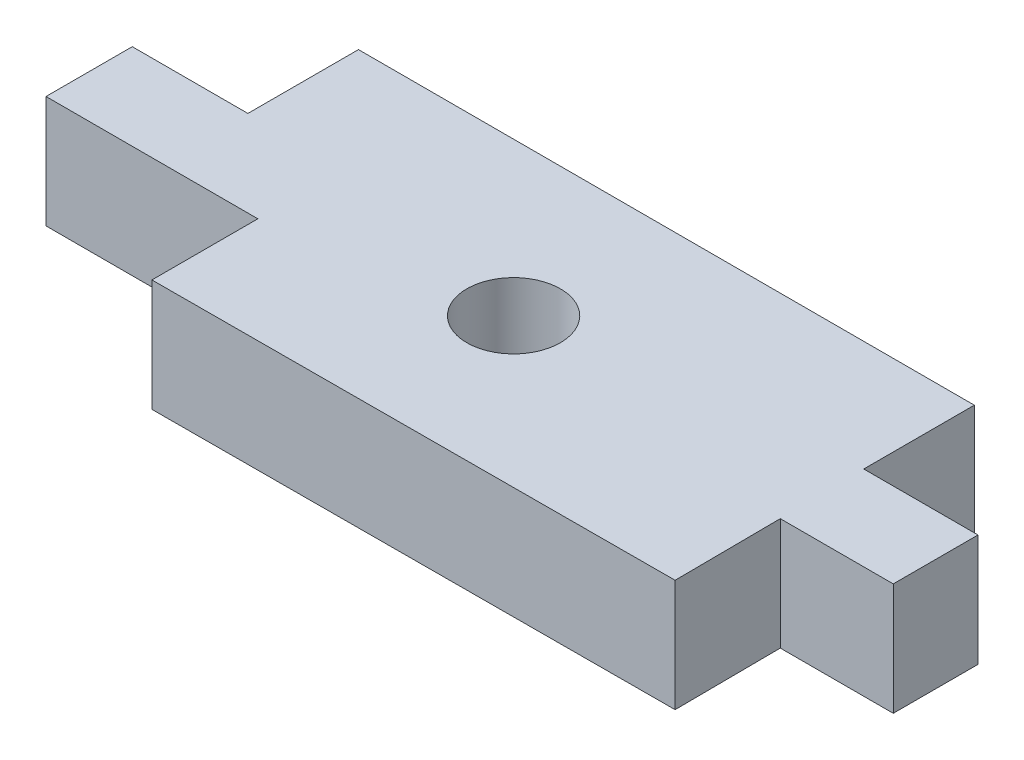
ISO-10303-21;
HEADER;
FILE_DESCRIPTION(('STEP AP214'),'2;1');
FILE_NAME('part.step','',(''),(''),'','','');
FILE_SCHEMA(('AUTOMOTIVE_DESIGN { 1 0 10303 214 1 1 1 1 }'));
ENDSEC;
DATA;
#1=APPLICATION_CONTEXT('core data for automotive mechanical design processes');
#2=APPLICATION_PROTOCOL_DEFINITION('international standard','automotive_design',2000,#1);
#3=PRODUCT_CONTEXT('',#1,'mechanical');
#4=PRODUCT('Part','Part','',(#3));
#5=PRODUCT_RELATED_PRODUCT_CATEGORY('part','',(#4));
#6=PRODUCT_DEFINITION_FORMATION('','',#4);
#7=PRODUCT_DEFINITION_CONTEXT('part definition',#1,'design');
#8=PRODUCT_DEFINITION('design','',#6,#7);
#9=PRODUCT_DEFINITION_SHAPE('','',#8);
#10=(LENGTH_UNIT() NAMED_UNIT(*) SI_UNIT(.MILLI.,.METRE.));
#11=(NAMED_UNIT(*) PLANE_ANGLE_UNIT() SI_UNIT($,.RADIAN.));
#12=(NAMED_UNIT(*) SI_UNIT($,.STERADIAN.) SOLID_ANGLE_UNIT());
#13=UNCERTAINTY_MEASURE_WITH_UNIT(LENGTH_MEASURE(1.E-05),#10,'distance_accuracy_value','');
#14=(GEOMETRIC_REPRESENTATION_CONTEXT(3) GLOBAL_UNCERTAINTY_ASSIGNED_CONTEXT((#13)) GLOBAL_UNIT_ASSIGNED_CONTEXT((#10,
#11,#12)) REPRESENTATION_CONTEXT('',''));
#15=CARTESIAN_POINT('',(0.,0.,0.));
#16=DIRECTION('',(0.,0.,1.));
#17=DIRECTION('',(1.,0.,0.));
#18=AXIS2_PLACEMENT_3D('',#15,#16,#17);
#19=CARTESIAN_POINT('',(0.,3.175,0.));
#20=DIRECTION('',(0.,-1.,0.));
#21=DIRECTION('',(0.,0.,-1.));
#22=AXIS2_PLACEMENT_3D('',#19,#20,#21);
#23=PLANE('',#22);
#24=DIRECTION('',(0.,0.,1.));
#25=VECTOR('',#24,1.);
#26=CARTESIAN_POINT('',(109.997615957605,3.175,-129.036436459114));
#27=LINE('',#26,#25);
#28=CARTESIAN_POINT('',(109.997615957605,3.175,-132.168236459114));
#29=VERTEX_POINT('',#28);
#30=CARTESIAN_POINT('',(109.997615957605,3.175,-129.036436459114));
#31=VERTEX_POINT('',#30);
#32=EDGE_CURVE('E179',#29,#31,#27,.T.);
#33=ORIENTED_EDGE('',*,*,#32,.T.);
#34=DIRECTION('',(-1.,0.,0.));
#35=VECTOR('',#34,1.);
#36=CARTESIAN_POINT('',(106.722915957605,3.175,-129.036436459114));
#37=LINE('',#36,#35);
#38=CARTESIAN_POINT('',(106.722915957605,3.175,-129.036436459114));
#39=VERTEX_POINT('',#38);
#40=EDGE_CURVE('E107',#31,#39,#37,.T.);
#41=ORIENTED_EDGE('',*,*,#40,.T.);
#42=DIRECTION('',(0.,0.,1.));
#43=VECTOR('',#42,1.);
#44=CARTESIAN_POINT('',(106.722915957605,3.175,-129.036436459114));
#45=LINE('',#44,#43);
#46=CARTESIAN_POINT('',(106.722915957605,3.175,-126.593302227627));
#47=VERTEX_POINT('',#46);
#48=EDGE_CURVE('E206',#39,#47,#45,.T.);
#49=ORIENTED_EDGE('',*,*,#48,.T.);
#50=DIRECTION('',(1.,0.,0.));
#51=VECTOR('',#50,1.);
#52=CARTESIAN_POINT('',(112.722877294147,3.175,-126.593302227627));
#53=LINE('',#52,#51);
#54=CARTESIAN_POINT('',(112.722877294147,3.175,-126.593302227627));
#55=VERTEX_POINT('',#54);
#56=EDGE_CURVE('E225',#47,#55,#53,.T.);
#57=ORIENTED_EDGE('',*,*,#56,.T.);
#58=DIRECTION('',(-3.36371008937517E-05,0.,0.999999999434273));
#59=VECTOR('',#58,1.);
#60=CARTESIAN_POINT('',(112.722877294147,3.175,-126.593302227627));
#61=LINE('',#60,#59);
#62=CARTESIAN_POINT('',(112.722776380156,3.175,-123.593222295389));
#63=VERTEX_POINT('',#62);
#64=EDGE_CURVE('E222',#55,#63,#61,.T.);
#65=ORIENTED_EDGE('',*,*,#64,.T.);
#66=DIRECTION('',(0.999995722637218,0.,-0.00292484311857202));
#67=VECTOR('',#66,1.);
#68=CARTESIAN_POINT('',(112.722776380156,3.175,-123.593222295389));
#69=LINE('',#68,#67);
#70=CARTESIAN_POINT('',(127.497578696098,3.175,-123.636436459114));
#71=VERTEX_POINT('',#70);
#72=EDGE_CURVE('E224',#63,#71,#69,.T.);
#73=ORIENTED_EDGE('',*,*,#72,.T.);
#74=DIRECTION('',(-0.00719981338325912,0.,-0.999974081007726));
#75=VECTOR('',#74,1.);
#76=CARTESIAN_POINT('',(127.475978696098,3.175,-126.636436459114));
#77=LINE('',#76,#75);
#78=CARTESIAN_POINT('',(127.475978696098,3.175,-126.636436459114));
#79=VERTEX_POINT('',#78);
#80=EDGE_CURVE('E227',#71,#79,#77,.T.);
#81=ORIENTED_EDGE('',*,*,#80,.T.);
#82=DIRECTION('',(1.,0.,0.));
#83=VECTOR('',#82,1.);
#84=CARTESIAN_POINT('',(130.675779855545,3.175,-126.636436459114));
#85=LINE('',#84,#83);
#86=CARTESIAN_POINT('',(130.675779855545,3.175,-126.636436459114));
#87=VERTEX_POINT('',#86);
#88=EDGE_CURVE('E233',#79,#87,#85,.T.);
#89=ORIENTED_EDGE('',*,*,#88,.T.);
#90=DIRECTION('',(0.,0.,-1.));
#91=VECTOR('',#90,1.);
#92=CARTESIAN_POINT('',(130.675779855545,3.175,-129.036436459114));
#93=LINE('',#92,#91);
#94=CARTESIAN_POINT('',(130.675779855545,3.175,-129.036436459114));
#95=VERTEX_POINT('',#94);
#96=EDGE_CURVE('E138',#87,#95,#93,.T.);
#97=ORIENTED_EDGE('',*,*,#96,.T.);
#98=DIRECTION('',(-1.,0.,0.));
#99=VECTOR('',#98,1.);
#100=CARTESIAN_POINT('',(130.675779855545,3.175,-129.036436459114));
#101=LINE('',#100,#99);
#102=CARTESIAN_POINT('',(127.440025110759,3.175,-129.036436459114));
#103=VERTEX_POINT('',#102);
#104=EDGE_CURVE('E132',#95,#103,#101,.T.);
#105=ORIENTED_EDGE('',*,*,#104,.T.);
#106=DIRECTION('',(0.,0.,-1.));
#107=VECTOR('',#106,1.);
#108=CARTESIAN_POINT('',(127.440025110759,3.175,-129.036436459114));
#109=LINE('',#108,#107);
#110=CARTESIAN_POINT('',(127.440025110759,3.175,-132.168236459114));
#111=VERTEX_POINT('',#110);
#112=EDGE_CURVE('E136',#103,#111,#109,.T.);
#113=ORIENTED_EDGE('',*,*,#112,.T.);
#114=DIRECTION('',(-1.,0.,0.));
#115=VECTOR('',#114,1.);
#116=CARTESIAN_POINT('',(109.997615957605,3.175,-132.168236459114));
#117=LINE('',#116,#115);
#118=EDGE_CURVE('E52',#111,#29,#117,.T.);
#119=ORIENTED_EDGE('',*,*,#118,.T.);
#120=EDGE_LOOP('',(#33,#41,#49,#57,#65,#73,#81,#89,#97,#105,#113,#119));
#121=FACE_BOUND('',#120,.T.);
#122=CARTESIAN_POINT('',(118.723210584464,3.175,-127.836436459114));
#123=DIRECTION('',(0.,1.,0.));
#124=DIRECTION('',(0.,0.,1.));
#125=AXIS2_PLACEMENT_3D('',#122,#123,#124);
#126=CIRCLE('',#125,1.32501209994475);
#127=CARTESIAN_POINT('',(118.723210584464,3.175,-126.511424359169));
#128=VERTEX_POINT('',#127);
#129=EDGE_CURVE('E160',#128,#128,#126,.T.);
#130=ORIENTED_EDGE('',*,*,#129,.F.);
#131=EDGE_LOOP('',(#130));
#132=FACE_BOUND('',#131,.T.);
#133=ADVANCED_FACE('F35',(#121,#132),#23,.F.);
#134=CARTESIAN_POINT('',(0.,0.,0.));
#135=DIRECTION('',(0.,-1.,0.));
#136=DIRECTION('',(0.,0.,-1.));
#137=AXIS2_PLACEMENT_3D('',#134,#135,#136);
#138=PLANE('',#137);
#139=DIRECTION('',(0.,0.,1.));
#140=VECTOR('',#139,1.);
#141=CARTESIAN_POINT('',(109.997615957605,0.,-129.036436459114));
#142=LINE('',#141,#140);
#143=CARTESIAN_POINT('',(109.997615957605,0.,-132.168236459114));
#144=VERTEX_POINT('',#143);
#145=CARTESIAN_POINT('',(109.997615957605,0.,-129.036436459114));
#146=VERTEX_POINT('',#145);
#147=EDGE_CURVE('E156',#144,#146,#142,.T.);
#148=ORIENTED_EDGE('',*,*,#147,.F.);
#149=DIRECTION('',(-1.,0.,0.));
#150=VECTOR('',#149,1.);
#151=CARTESIAN_POINT('',(109.997615957605,0.,-132.168236459114));
#152=LINE('',#151,#150);
#153=CARTESIAN_POINT('',(127.440025110759,0.,-132.168236459114));
#154=VERTEX_POINT('',#153);
#155=EDGE_CURVE('E99',#154,#144,#152,.T.);
#156=ORIENTED_EDGE('',*,*,#155,.F.);
#157=DIRECTION('',(0.,0.,-1.));
#158=VECTOR('',#157,1.);
#159=CARTESIAN_POINT('',(127.440025110759,0.,-129.036436459114));
#160=LINE('',#159,#158);
#161=CARTESIAN_POINT('',(127.440025110759,0.,-129.036436459114));
#162=VERTEX_POINT('',#161);
#163=EDGE_CURVE('E93',#162,#154,#160,.T.);
#164=ORIENTED_EDGE('',*,*,#163,.F.);
#165=DIRECTION('',(-1.,0.,0.));
#166=VECTOR('',#165,1.);
#167=CARTESIAN_POINT('',(130.675779855545,0.,-129.036436459114));
#168=LINE('',#167,#166);
#169=CARTESIAN_POINT('',(130.675779855545,0.,-129.036436459114));
#170=VERTEX_POINT('',#169);
#171=EDGE_CURVE('E146',#170,#162,#168,.T.);
#172=ORIENTED_EDGE('',*,*,#171,.F.);
#173=DIRECTION('',(0.,0.,-1.));
#174=VECTOR('',#173,1.);
#175=CARTESIAN_POINT('',(130.675779855545,0.,-129.036436459114));
#176=LINE('',#175,#174);
#177=CARTESIAN_POINT('',(130.675779855545,0.,-126.636436459114));
#178=VERTEX_POINT('',#177);
#179=EDGE_CURVE('E174',#178,#170,#176,.T.);
#180=ORIENTED_EDGE('',*,*,#179,.F.);
#181=DIRECTION('',(1.,0.,0.));
#182=VECTOR('',#181,1.);
#183=CARTESIAN_POINT('',(130.675779855545,0.,-126.636436459114));
#184=LINE('',#183,#182);
#185=CARTESIAN_POINT('',(127.475978696098,0.,-126.636436459114));
#186=VERTEX_POINT('',#185);
#187=EDGE_CURVE('E172',#186,#178,#184,.T.);
#188=ORIENTED_EDGE('',*,*,#187,.F.);
#189=DIRECTION('',(-0.00719981338325912,0.,-0.999974081007726));
#190=VECTOR('',#189,1.);
#191=CARTESIAN_POINT('',(127.475978696098,0.,-126.636436459114));
#192=LINE('',#191,#190);
#193=CARTESIAN_POINT('',(127.497578696098,0.,-123.636436459114));
#194=VERTEX_POINT('',#193);
#195=EDGE_CURVE('E170',#194,#186,#192,.T.);
#196=ORIENTED_EDGE('',*,*,#195,.F.);
#197=DIRECTION('',(0.999995722637218,0.,-0.00292484311857202));
#198=VECTOR('',#197,1.);
#199=CARTESIAN_POINT('',(112.722776380156,0.,-123.593222295389));
#200=LINE('',#199,#198);
#201=CARTESIAN_POINT('',(112.722776380156,0.,-123.593222295389));
#202=VERTEX_POINT('',#201);
#203=EDGE_CURVE('E168',#202,#194,#200,.T.);
#204=ORIENTED_EDGE('',*,*,#203,.F.);
#205=DIRECTION('',(-3.36371008937517E-05,0.,0.999999999434273));
#206=VECTOR('',#205,1.);
#207=CARTESIAN_POINT('',(112.722877294147,0.,-126.593302227627));
#208=LINE('',#207,#206);
#209=CARTESIAN_POINT('',(112.722877294147,0.,-126.593302227627));
#210=VERTEX_POINT('',#209);
#211=EDGE_CURVE('E166',#210,#202,#208,.T.);
#212=ORIENTED_EDGE('',*,*,#211,.F.);
#213=DIRECTION('',(1.,0.,0.));
#214=VECTOR('',#213,1.);
#215=CARTESIAN_POINT('',(112.722877294147,0.,-126.593302227627));
#216=LINE('',#215,#214);
#217=CARTESIAN_POINT('',(106.722915957605,0.,-126.593302227627));
#218=VERTEX_POINT('',#217);
#219=EDGE_CURVE('E164',#218,#210,#216,.T.);
#220=ORIENTED_EDGE('',*,*,#219,.F.);
#221=DIRECTION('',(0.,0.,1.));
#222=VECTOR('',#221,1.);
#223=CARTESIAN_POINT('',(106.722915957605,0.,-129.036436459114));
#224=LINE('',#223,#222);
#225=CARTESIAN_POINT('',(106.722915957605,0.,-129.036436459114));
#226=VERTEX_POINT('',#225);
#227=EDGE_CURVE('E162',#226,#218,#224,.T.);
#228=ORIENTED_EDGE('',*,*,#227,.F.);
#229=DIRECTION('',(-1.,0.,0.));
#230=VECTOR('',#229,1.);
#231=CARTESIAN_POINT('',(106.722915957605,0.,-129.036436459114));
#232=LINE('',#231,#230);
#233=EDGE_CURVE('E159',#146,#226,#232,.T.);
#234=ORIENTED_EDGE('',*,*,#233,.F.);
#235=EDGE_LOOP('',(#148,#156,#164,#172,#180,#188,#196,#204,#212,#220,#228,#234));
#236=FACE_BOUND('',#235,.T.);
#237=CARTESIAN_POINT('',(118.723210584464,0.,-127.836436459114));
#238=DIRECTION('',(0.,1.,0.));
#239=DIRECTION('',(0.,0.,1.));
#240=AXIS2_PLACEMENT_3D('',#237,#238,#239);
#241=CIRCLE('',#240,1.32501209994475);
#242=CARTESIAN_POINT('',(118.723210584464,0.,-126.511424359169));
#243=VERTEX_POINT('',#242);
#244=EDGE_CURVE('E380',#243,#243,#241,.T.);
#245=ORIENTED_EDGE('',*,*,#244,.T.);
#246=EDGE_LOOP('',(#245));
#247=FACE_BOUND('',#246,.T.);
#248=ADVANCED_FACE('F210',(#236,#247),#138,.T.);
#249=CARTESIAN_POINT('',(109.997615957605,3.175,-129.036436459114));
#250=DIRECTION('',(1.,0.,0.));
#251=DIRECTION('',(0.,0.,-1.));
#252=AXIS2_PLACEMENT_3D('',#249,#250,#251);
#253=PLANE('',#252);
#254=ORIENTED_EDGE('',*,*,#147,.T.);
#255=DIRECTION('',(0.,-1.,0.));
#256=VECTOR('',#255,1.);
#257=CARTESIAN_POINT('',(109.997615957605,3.175,-129.036436459114));
#258=LINE('',#257,#256);
#259=EDGE_CURVE('E11',#31,#146,#258,.T.);
#260=ORIENTED_EDGE('',*,*,#259,.F.);
#261=ORIENTED_EDGE('',*,*,#32,.F.);
#262=DIRECTION('',(0.,-1.,0.));
#263=VECTOR('',#262,1.);
#264=CARTESIAN_POINT('',(109.997615957605,3.175,-132.168236459114));
#265=LINE('',#264,#263);
#266=EDGE_CURVE('E152',#29,#144,#265,.T.);
#267=ORIENTED_EDGE('',*,*,#266,.T.);
#268=EDGE_LOOP('',(#254,#260,#261,#267));
#269=FACE_BOUND('',#268,.T.);
#270=ADVANCED_FACE('F37',(#269),#253,.F.);
#271=CARTESIAN_POINT('',(106.722915957605,3.175,-129.036436459114));
#272=DIRECTION('',(0.,0.,1.));
#273=DIRECTION('',(1.,0.,0.));
#274=AXIS2_PLACEMENT_3D('',#271,#272,#273);
#275=PLANE('',#274);
#276=ORIENTED_EDGE('',*,*,#233,.T.);
#277=DIRECTION('',(0.,-1.,0.));
#278=VECTOR('',#277,1.);
#279=CARTESIAN_POINT('',(106.722915957605,3.175,-129.036436459114));
#280=LINE('',#279,#278);
#281=EDGE_CURVE('E44',#39,#226,#280,.T.);
#282=ORIENTED_EDGE('',*,*,#281,.F.);
#283=ORIENTED_EDGE('',*,*,#40,.F.);
#284=ORIENTED_EDGE('',*,*,#259,.T.);
#285=EDGE_LOOP('',(#276,#282,#283,#284));
#286=FACE_BOUND('',#285,.T.);
#287=ADVANCED_FACE('F267',(#286),#275,.F.);
#288=CARTESIAN_POINT('',(106.722915957605,3.175,-129.036436459114));
#289=DIRECTION('',(1.,0.,0.));
#290=DIRECTION('',(0.,0.,-1.));
#291=AXIS2_PLACEMENT_3D('',#288,#289,#290);
#292=PLANE('',#291);
#293=ORIENTED_EDGE('',*,*,#227,.T.);
#294=DIRECTION('',(0.,-1.,0.));
#295=VECTOR('',#294,1.);
#296=CARTESIAN_POINT('',(106.722915957605,3.175,-126.593302227627));
#297=LINE('',#296,#295);
#298=EDGE_CURVE('E198',#47,#218,#297,.T.);
#299=ORIENTED_EDGE('',*,*,#298,.F.);
#300=ORIENTED_EDGE('',*,*,#48,.F.);
#301=ORIENTED_EDGE('',*,*,#281,.T.);
#302=EDGE_LOOP('',(#293,#299,#300,#301));
#303=FACE_BOUND('',#302,.T.);
#304=ADVANCED_FACE('F204',(#303),#292,.F.);
#305=CARTESIAN_POINT('',(112.722877294147,3.175,-126.593302227627));
#306=DIRECTION('',(0.,0.,-1.));
#307=DIRECTION('',(-1.,0.,0.));
#308=AXIS2_PLACEMENT_3D('',#305,#306,#307);
#309=PLANE('',#308);
#310=ORIENTED_EDGE('',*,*,#219,.T.);
#311=DIRECTION('',(0.,-1.,0.));
#312=VECTOR('',#311,1.);
#313=CARTESIAN_POINT('',(112.722877294147,3.175,-126.593302227627));
#314=LINE('',#313,#312);
#315=EDGE_CURVE('E195',#55,#210,#314,.T.);
#316=ORIENTED_EDGE('',*,*,#315,.F.);
#317=ORIENTED_EDGE('',*,*,#56,.F.);
#318=ORIENTED_EDGE('',*,*,#298,.T.);
#319=EDGE_LOOP('',(#310,#316,#317,#318));
#320=FACE_BOUND('',#319,.T.);
#321=ADVANCED_FACE('F216',(#320),#309,.F.);
#322=CARTESIAN_POINT('',(112.722877294147,3.175,-126.593302227627));
#323=DIRECTION('',(0.999999999434273,0.,3.36371008937517E-05));
#324=DIRECTION('',(3.36371008937517E-05,0.,-0.999999999434273));
#325=AXIS2_PLACEMENT_3D('',#322,#323,#324);
#326=PLANE('',#325);
#327=ORIENTED_EDGE('',*,*,#211,.T.);
#328=DIRECTION('',(0.,-1.,0.));
#329=VECTOR('',#328,1.);
#330=CARTESIAN_POINT('',(112.722776380156,3.175,-123.593222295389));
#331=LINE('',#330,#329);
#332=EDGE_CURVE('E192',#63,#202,#331,.T.);
#333=ORIENTED_EDGE('',*,*,#332,.F.);
#334=ORIENTED_EDGE('',*,*,#64,.F.);
#335=ORIENTED_EDGE('',*,*,#315,.T.);
#336=EDGE_LOOP('',(#327,#333,#334,#335));
#337=FACE_BOUND('',#336,.T.);
#338=ADVANCED_FACE('F220',(#337),#326,.F.);
#339=CARTESIAN_POINT('',(112.722776380156,3.175,-123.593222295389));
#340=DIRECTION('',(-0.00292484311857202,0.,-0.999995722637218));
#341=DIRECTION('',(-0.999995722637218,0.,0.00292484311857202));
#342=AXIS2_PLACEMENT_3D('',#339,#340,#341);
#343=PLANE('',#342);
#344=ORIENTED_EDGE('',*,*,#203,.T.);
#345=DIRECTION('',(0.,-1.,0.));
#346=VECTOR('',#345,1.);
#347=CARTESIAN_POINT('',(127.497578696098,3.175,-123.636436459114));
#348=LINE('',#347,#346);
#349=EDGE_CURVE('E189',#71,#194,#348,.T.);
#350=ORIENTED_EDGE('',*,*,#349,.F.);
#351=ORIENTED_EDGE('',*,*,#72,.F.);
#352=ORIENTED_EDGE('',*,*,#332,.T.);
#353=EDGE_LOOP('',(#344,#350,#351,#352));
#354=FACE_BOUND('',#353,.T.);
#355=ADVANCED_FACE('F280',(#354),#343,.F.);
#356=CARTESIAN_POINT('',(127.475978696098,3.175,-126.636436459114));
#357=DIRECTION('',(-0.999974081007726,0.,0.00719981338325912));
#358=DIRECTION('',(0.00719981338325912,0.,0.999974081007726));
#359=AXIS2_PLACEMENT_3D('',#356,#357,#358);
#360=PLANE('',#359);
#361=ORIENTED_EDGE('',*,*,#195,.T.);
#362=DIRECTION('',(0.,-1.,0.));
#363=VECTOR('',#362,1.);
#364=CARTESIAN_POINT('',(127.475978696098,3.175,-126.636436459114));
#365=LINE('',#364,#363);
#366=EDGE_CURVE('E186',#79,#186,#365,.T.);
#367=ORIENTED_EDGE('',*,*,#366,.F.);
#368=ORIENTED_EDGE('',*,*,#80,.F.);
#369=ORIENTED_EDGE('',*,*,#349,.T.);
#370=EDGE_LOOP('',(#361,#367,#368,#369));
#371=FACE_BOUND('',#370,.T.);
#372=ADVANCED_FACE('F283',(#371),#360,.F.);
#373=CARTESIAN_POINT('',(130.675779855545,3.175,-126.636436459114));
#374=DIRECTION('',(0.,0.,-1.));
#375=DIRECTION('',(-1.,0.,0.));
#376=AXIS2_PLACEMENT_3D('',#373,#374,#375);
#377=PLANE('',#376);
#378=ORIENTED_EDGE('',*,*,#187,.T.);
#379=DIRECTION('',(0.,-1.,0.));
#380=VECTOR('',#379,1.);
#381=CARTESIAN_POINT('',(130.675779855545,3.175,-126.636436459114));
#382=LINE('',#381,#380);
#383=EDGE_CURVE('E183',#87,#178,#382,.T.);
#384=ORIENTED_EDGE('',*,*,#383,.F.);
#385=ORIENTED_EDGE('',*,*,#88,.F.);
#386=ORIENTED_EDGE('',*,*,#366,.T.);
#387=EDGE_LOOP('',(#378,#384,#385,#386));
#388=FACE_BOUND('',#387,.T.);
#389=ADVANCED_FACE('F239',(#388),#377,.F.);
#390=CARTESIAN_POINT('',(130.675779855545,3.175,-129.036436459114));
#391=DIRECTION('',(-1.,0.,0.));
#392=DIRECTION('',(0.,0.,1.));
#393=AXIS2_PLACEMENT_3D('',#390,#391,#392);
#394=PLANE('',#393);
#395=ORIENTED_EDGE('',*,*,#179,.T.);
#396=DIRECTION('',(0.,-1.,0.));
#397=VECTOR('',#396,1.);
#398=CARTESIAN_POINT('',(130.675779855545,3.175,-129.036436459114));
#399=LINE('',#398,#397);
#400=EDGE_CURVE('E147',#95,#170,#399,.T.);
#401=ORIENTED_EDGE('',*,*,#400,.F.);
#402=ORIENTED_EDGE('',*,*,#96,.F.);
#403=ORIENTED_EDGE('',*,*,#383,.T.);
#404=EDGE_LOOP('',(#395,#401,#402,#403));
#405=FACE_BOUND('',#404,.T.);
#406=ADVANCED_FACE('F243',(#405),#394,.F.);
#407=CARTESIAN_POINT('',(130.675779855545,3.175,-129.036436459114));
#408=DIRECTION('',(0.,0.,1.));
#409=DIRECTION('',(1.,0.,0.));
#410=AXIS2_PLACEMENT_3D('',#407,#408,#409);
#411=PLANE('',#410);
#412=ORIENTED_EDGE('',*,*,#171,.T.);
#413=DIRECTION('',(0.,-1.,0.));
#414=VECTOR('',#413,1.);
#415=CARTESIAN_POINT('',(127.440025110759,3.175,-129.036436459114));
#416=LINE('',#415,#414);
#417=EDGE_CURVE('E143',#103,#162,#416,.T.);
#418=ORIENTED_EDGE('',*,*,#417,.F.);
#419=ORIENTED_EDGE('',*,*,#104,.F.);
#420=ORIENTED_EDGE('',*,*,#400,.T.);
#421=EDGE_LOOP('',(#412,#418,#419,#420));
#422=FACE_BOUND('',#421,.T.);
#423=ADVANCED_FACE('F144',(#422),#411,.F.);
#424=CARTESIAN_POINT('',(127.440025110759,3.175,-129.036436459114));
#425=DIRECTION('',(-1.,0.,0.));
#426=DIRECTION('',(0.,0.,1.));
#427=AXIS2_PLACEMENT_3D('',#424,#425,#426);
#428=PLANE('',#427);
#429=ORIENTED_EDGE('',*,*,#163,.T.);
#430=DIRECTION('',(0.,-1.,0.));
#431=VECTOR('',#430,1.);
#432=CARTESIAN_POINT('',(127.440025110759,3.175,-132.168236459114));
#433=LINE('',#432,#431);
#434=EDGE_CURVE('E148',#111,#154,#433,.T.);
#435=ORIENTED_EDGE('',*,*,#434,.F.);
#436=ORIENTED_EDGE('',*,*,#112,.F.);
#437=ORIENTED_EDGE('',*,*,#417,.T.);
#438=EDGE_LOOP('',(#429,#435,#436,#437));
#439=FACE_BOUND('',#438,.T.);
#440=ADVANCED_FACE('F150',(#439),#428,.F.);
#441=CARTESIAN_POINT('',(109.997615957605,3.175,-132.168236459114));
#442=DIRECTION('',(0.,0.,1.));
#443=DIRECTION('',(1.,0.,0.));
#444=AXIS2_PLACEMENT_3D('',#441,#442,#443);
#445=PLANE('',#444);
#446=ORIENTED_EDGE('',*,*,#155,.T.);
#447=ORIENTED_EDGE('',*,*,#266,.F.);
#448=ORIENTED_EDGE('',*,*,#118,.F.);
#449=ORIENTED_EDGE('',*,*,#434,.T.);
#450=EDGE_LOOP('',(#446,#447,#448,#449));
#451=FACE_BOUND('',#450,.T.);
#452=ADVANCED_FACE('F247',(#451),#445,.F.);
#453=CARTESIAN_POINT('',(118.723210584464,3.175,-127.836436459114));
#454=DIRECTION('',(0.,-1.,0.));
#455=DIRECTION('',(0.,0.,-1.));
#456=AXIS2_PLACEMENT_3D('',#453,#454,#455);
#457=CYLINDRICAL_SURFACE('',#456,1.32501209994475);
#458=ORIENTED_EDGE('',*,*,#129,.T.);
#459=EDGE_LOOP('',(#458));
#460=FACE_BOUND('',#459,.T.);
#461=ORIENTED_EDGE('',*,*,#244,.F.);
#462=EDGE_LOOP('',(#461));
#463=FACE_BOUND('',#462,.T.);
#464=ADVANCED_FACE('F249',(#460,#463),#457,.F.);
#465=CLOSED_SHELL('',(#133,#248,#270,#287,#304,#321,#338,#355,#372,#389,#406,#423,#440,#452,#464));
#466=MANIFOLD_SOLID_BREP('B2',#465);
#467=ADVANCED_BREP_SHAPE_REPRESENTATION('',(#18,#466),#14);
#468=SHAPE_DEFINITION_REPRESENTATION(#9,#467);
ENDSEC;
END-ISO-10303-21;
